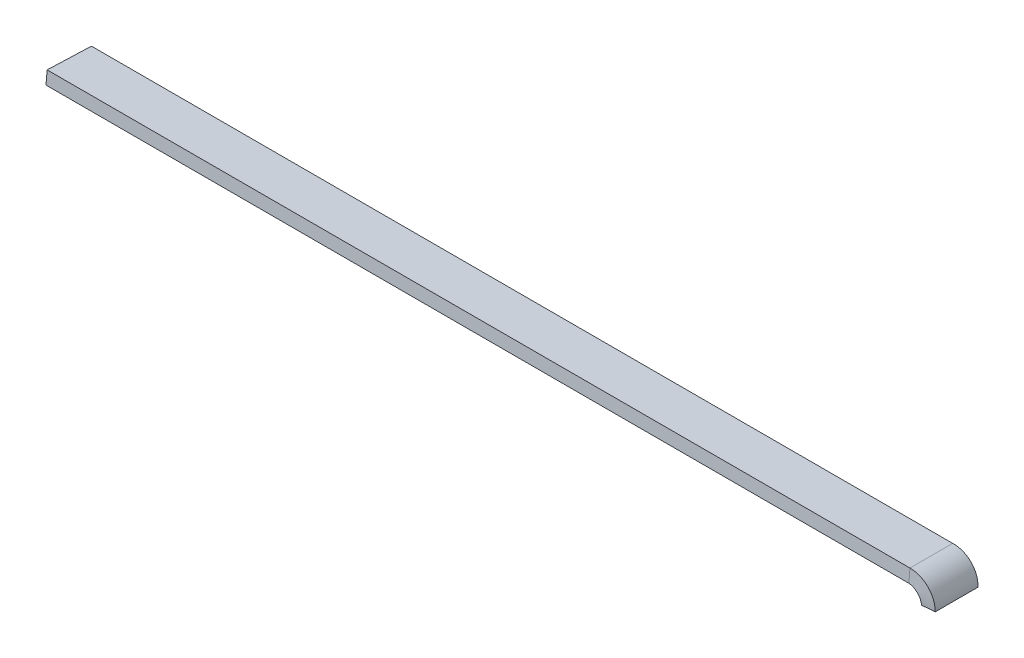
ISO-10303-21;
HEADER;
FILE_DESCRIPTION(('STEP AP214'),'2;1');
FILE_NAME('part.step','',(''),(''),'','','');
FILE_SCHEMA(('AUTOMOTIVE_DESIGN { 1 0 10303 214 1 1 1 1 }'));
ENDSEC;
DATA;
#1=APPLICATION_CONTEXT('core data for automotive mechanical design processes');
#2=APPLICATION_PROTOCOL_DEFINITION('international standard','automotive_design',2000,#1);
#3=PRODUCT_CONTEXT('',#1,'mechanical');
#4=PRODUCT('Part','Part','',(#3));
#5=PRODUCT_RELATED_PRODUCT_CATEGORY('part','',(#4));
#6=PRODUCT_DEFINITION_FORMATION('','',#4);
#7=PRODUCT_DEFINITION_CONTEXT('part definition',#1,'design');
#8=PRODUCT_DEFINITION('design','',#6,#7);
#9=PRODUCT_DEFINITION_SHAPE('','',#8);
#10=(LENGTH_UNIT() NAMED_UNIT(*) SI_UNIT(.MILLI.,.METRE.));
#11=(NAMED_UNIT(*) PLANE_ANGLE_UNIT() SI_UNIT($,.RADIAN.));
#12=(NAMED_UNIT(*) SI_UNIT($,.STERADIAN.) SOLID_ANGLE_UNIT());
#13=UNCERTAINTY_MEASURE_WITH_UNIT(LENGTH_MEASURE(1.E-05),#10,'distance_accuracy_value','');
#14=(GEOMETRIC_REPRESENTATION_CONTEXT(3) GLOBAL_UNCERTAINTY_ASSIGNED_CONTEXT((#13)) GLOBAL_UNIT_ASSIGNED_CONTEXT((#10,
#11,#12)) REPRESENTATION_CONTEXT('',''));
#15=CARTESIAN_POINT('',(0.,0.,0.));
#16=DIRECTION('',(0.,0.,1.));
#17=DIRECTION('',(1.,0.,0.));
#18=AXIS2_PLACEMENT_3D('',#15,#16,#17);
#19=CARTESIAN_POINT('',(0.9067001771097,5.017924103223,621.706));
#20=DIRECTION('',(-0.0868265938642471,-0.0868265938642471,-0.992432509138967));
#21=DIRECTION('',(-0.996194698091746,0.,0.0871557427476577));
#22=AXIS2_PLACEMENT_3D('',#19,#20,#21);
#23=CYLINDRICAL_SURFACE('',#22,1.);
#24=CARTESIAN_POINT('',(-42.3060066619831,-38.1947827366965,119.638604326719));
#25=CARTESIAN_POINT('',(-42.3413228470449,-38.1594269535071,119.638593813166));
#26=CARTESIAN_POINT('',(-42.3793150853468,-38.1267659827884,119.638855411307));
#27=CARTESIAN_POINT('',(-42.4597744274169,-38.0674292435776,119.639848616315));
#28=CARTESIAN_POINT('',(-42.5022461890844,-38.0407597971777,119.640580716528));
#29=CARTESIAN_POINT('',(-42.5961410293597,-37.9912123118771,119.642554607293));
#30=CARTESIAN_POINT('',(-42.648022858914,-37.9692020525853,119.643847948622));
#31=CARTESIAN_POINT('',(-42.7546831120349,-37.9342240884301,119.64690509844));
#32=CARTESIAN_POINT('',(-42.8094574519616,-37.9212439835882,119.648668257165));
#33=CARTESIAN_POINT('',(-42.8887916499294,-37.9093528668859,119.651546358698));
#34=CARTESIAN_POINT('',(-42.9128391117539,-37.9066383607995,119.652460536334));
#35=CARTESIAN_POINT('',(-42.9610274450484,-37.9029606798878,119.654376358654));
#36=CARTESIAN_POINT('',(-42.9851681197073,-37.9019948569667,119.655377868672));
#37=CARTESIAN_POINT('',(-43.0093212811459,-37.9019026509197,119.656422129021));
#38=B_SPLINE_CURVE_WITH_KNOTS('',3,(#24,#25,#26,#27,#28,#29,#30,#31,#32,#33,#34,#35,#36,#37),
.UNSPECIFIED.,.F.,.F.,(4,2,2,2,2,2,4),(0.,0.149753145675987,0.299663572257379,0.46798334398652,
0.636071524624927,0.708671414594532,0.78116127160662),.UNSPECIFIED.);
#39=CARTESIAN_POINT('',(-42.3060066619851,-38.1947827366984,119.638604326697));
#40=VERTEX_POINT('',#39);
#41=CARTESIAN_POINT('',(-43.0093212791851,-37.9019026509321,119.656422128847));
#42=VERTEX_POINT('',#41);
#43=EDGE_CURVE('E24',#40,#42,#38,.T.);
#44=ORIENTED_EDGE('',*,*,#43,.T.);
#45=DIRECTION('',(0.08682659340322,0.0868265938677577,0.992432509178995));
#46=VECTOR('',#45,1.);
#47=CARTESIAN_POINT('',(-43.0093212841001,-37.9019026607583,119.656422016491));
#48=LINE('',#47,#46);
#49=CARTESIAN_POINT('',(-42.8480291107502,-37.7406104866713,121.500000002396));
#50=VERTEX_POINT('',#49);
#51=EDGE_CURVE('E101',#42,#50,#48,.T.);
#52=ORIENTED_EDGE('',*,*,#51,.T.);
#53=CARTESIAN_POINT('',(-42.8480291107746,-37.7406104866848,121.500000002251));
#54=CARTESIAN_POINT('',(-42.7962110754583,-37.7405753106187,121.500011053066));
#55=CARTESIAN_POINT('',(-42.7444054838403,-37.7446278572814,121.499926275227));
#56=CARTESIAN_POINT('',(-42.6420403829662,-37.7606827291457,121.499655839995));
#57=CARTESIAN_POINT('',(-42.5914808762208,-37.7726850703646,121.499470182399));
#58=CARTESIAN_POINT('',(-42.4886919101101,-37.8057445695691,121.499072769477));
#59=CARTESIAN_POINT('',(-42.4366781049927,-37.8274767994237,121.498860131334));
#60=CARTESIAN_POINT('',(-42.3370631523629,-37.879394088344,121.498499793113));
#61=CARTESIAN_POINT('',(-42.2894616809946,-37.9095785263803,121.498352088266));
#62=CARTESIAN_POINT('',(-42.2001984244632,-37.9774133472322,121.498168438104));
#63=CARTESIAN_POINT('',(-42.158515540875,-38.0150360047178,121.498132085789));
#64=CARTESIAN_POINT('',(-42.0820546566997,-38.0967776449116,121.498181089337));
#65=CARTESIAN_POINT('',(-42.0472765518183,-38.1408965294789,121.49826644336));
#66=CARTESIAN_POINT('',(-42.0010718619447,-38.2109218030447,121.498461626571));
#67=CARTESIAN_POINT('',(-41.9866622032811,-38.2349088911212,121.498537897363));
#68=CARTESIAN_POINT('',(-41.9599233283921,-38.2839861342361,121.498706018941));
#69=CARTESIAN_POINT('',(-41.9475922384358,-38.3090752698278,121.498797855545));
#70=CARTESIAN_POINT('',(-41.9138382420349,-38.3857727892569,121.499087388104));
#71=CARTESIAN_POINT('',(-41.8956299806478,-38.4388486924575,121.499299229812));
#72=CARTESIAN_POINT('',(-41.8719763756272,-38.5328708459437,121.499627723138));
#73=CARTESIAN_POINT('',(-41.8644285955422,-38.5733096392885,121.499754729338));
#74=CARTESIAN_POINT('',(-41.8543570325861,-38.6547599963722,121.499939825366));
#75=CARTESIAN_POINT('',(-41.8518273543112,-38.6957708309246,121.499997996032));
#76=CARTESIAN_POINT('',(-41.8518344384368,-38.7368051667077,121.499999709199));
#77=B_SPLINE_CURVE_WITH_KNOTS('',3,(#53,#54,#55,#56,#57,#58,#59,#60,#61,#62,#63,#64,#65,#66,#67,
#68,#69,#70,#71,#72,#73,#74,#75,#76),.UNSPECIFIED.,.F.,.F.,(4,2,2,2,2,2,2,2,2,2,2,4),(0.,
0.155274136338601,0.31054858552287,0.478847467941307,0.647133987775294,0.814804674542826,
0.982472828505676,1.06633391722347,1.15011900011304,1.31755647247005,1.44068000924492,
1.56365881123626),.UNSPECIFIED.);
#78=CARTESIAN_POINT('',(-41.8518344384384,-38.7368051667078,121.4999997092));
#79=VERTEX_POINT('',#78);
#80=EDGE_CURVE('E121',#50,#79,#77,.T.);
#81=ORIENTED_EDGE('',*,*,#80,.T.);
#82=DIRECTION('',(0.0868265938625753,0.0868265938642524,0.992432509139113));
#83=VECTOR('',#82,1.);
#84=CARTESIAN_POINT('',(-42.01312668259,-38.898097410861,119.6564209225));
#85=LINE('',#84,#83);
#86=CARTESIAN_POINT('',(-42.0131266299219,-38.8980973581931,119.656421524499));
#87=VERTEX_POINT('',#86);
#88=EDGE_CURVE('E97',#87,#79,#85,.T.);
#89=ORIENTED_EDGE('',*,*,#88,.F.);
#90=CARTESIAN_POINT('',(-42.013126577157,-38.8980973319105,119.656422127603));
#91=CARTESIAN_POINT('',(-42.0132876373387,-38.8481792562705,119.654254624449));
#92=CARTESIAN_POINT('',(-42.0172390455984,-38.7982792455492,119.65228490139));
#93=CARTESIAN_POINT('',(-42.0325268082614,-38.6995482369846,119.648729684385));
#94=CARTESIAN_POINT('',(-42.0438718568742,-38.6507185677202,119.647144645808));
#95=CARTESIAN_POINT('',(-42.0756179083208,-38.5493169127379,119.64417795588));
#96=CARTESIAN_POINT('',(-42.0969739390252,-38.4970405094693,119.642846523088));
#97=CARTESIAN_POINT('',(-42.1481608993835,-38.3968693320253,119.640675388055));
#98=CARTESIAN_POINT('',(-42.177979612731,-38.348968372483,119.639834982301));
#99=CARTESIAN_POINT('',(-42.225977040728,-38.2846302528329,119.639069302541));
#100=CARTESIAN_POINT('',(-42.2410837040384,-38.2658411740296,119.63889548783));
#101=CARTESIAN_POINT('',(-42.2725900732733,-38.2294282906851,119.638663083063));
#102=CARTESIAN_POINT('',(-42.2889878285034,-38.2118027994575,119.63860432252));
#103=CARTESIAN_POINT('',(-42.306006661987,-38.1947827367003,119.638604326675));
#104=B_SPLINE_CURVE_WITH_KNOTS('',3,(#90,#91,#92,#93,#94,#95,#96,#97,#98,#99,#100,#101,#102,
#103),.UNSPECIFIED.,.F.,.F.,(4,2,2,2,2,2,4),(0.,0.149733606469797,0.299643603721288,
0.468299581467362,0.636713323524752,0.708990119965772,0.781159735963205),.UNSPECIFIED.);
#105=EDGE_CURVE('E95',#87,#40,#104,.T.);
#106=ORIENTED_EDGE('',*,*,#105,.T.);
#107=EDGE_LOOP('',(#44,#52,#81,#89,#106));
#108=FACE_BOUND('',#107,.T.);
#109=ADVANCED_FACE('F17',(#108),#23,.T.);
#110=CARTESIAN_POINT('',(-42.39254581876,-38.75555674729,121.545304739));
#111=CARTESIAN_POINT('',(-42.19854379232,-38.76340444666,121.5290183457));
#112=CARTESIAN_POINT('',(-42.00454176588,-38.77125214603,121.5127319524));
#113=CARTESIAN_POINT('',(-41.81053973944,-38.7790998454,121.4964455592));
#114=CARTESIAN_POINT('',(-42.39223019528,-38.74930632017,121.5459747104));
#115=CARTESIAN_POINT('',(-42.19813947052,-38.75453927643,121.5294517966));
#116=CARTESIAN_POINT('',(-42.00404874575,-38.75977223268,121.5129288829));
#117=CARTESIAN_POINT('',(-41.80995802099,-38.76500518894,121.4964059691));
#118=CARTESIAN_POINT('',(-42.38965937998,-38.66232931699,121.5550272977));
#119=CARTESIAN_POINT('',(-42.19509378997,-38.63116139852,121.5352781747));
#120=CARTESIAN_POINT('',(-42.00052819996,-38.59999348006,121.5155290517));
#121=CARTESIAN_POINT('',(-41.80596260996,-38.5688255616,121.4957799288));
#122=CARTESIAN_POINT('',(-42.43303465109,-38.4958007504,121.5654113252));
#123=CARTESIAN_POINT('',(-42.25770700477,-38.39452889858,121.5412120048));
#124=CARTESIAN_POINT('',(-42.08237935846,-38.29325704675,121.5170126844));
#125=CARTESIAN_POINT('',(-41.90705171214,-38.19198519492,121.4928133639));
#126=CARTESIAN_POINT('',(-42.60840763403,-38.32115815075,121.5653232954));
#127=CARTESIAN_POINT('',(-42.50771884144,-38.14554717545,121.541150198));
#128=CARTESIAN_POINT('',(-42.40703004886,-37.96993620014,121.5169771006));
#129=CARTESIAN_POINT('',(-42.30634125627,-37.79432522483,121.4928040031));
#130=CARTESIAN_POINT('',(-42.77429486765,-38.27842250574,121.5550085009));
#131=CARTESIAN_POINT('',(-42.74343958104,-38.08384837702,121.5352859826));
#132=CARTESIAN_POINT('',(-42.71258429442,-37.88927424831,121.5155634644));
#133=CARTESIAN_POINT('',(-42.6817290078,-37.69470011959,121.4958409461));
#134=CARTESIAN_POINT('',(-42.86073951127,-38.28101321544,121.5459446643));
#135=CARTESIAN_POINT('',(-42.8660597417,-38.08692365148,121.5294294876));
#136=CARTESIAN_POINT('',(-42.87137997212,-37.89283408751,121.5129143109));
#137=CARTESIAN_POINT('',(-42.87670020254,-37.69874452355,121.4963991342));
#138=CARTESIAN_POINT('',(-42.86709224571,-38.2813388599,121.5452578034));
#139=CARTESIAN_POINT('',(-42.87506978468,-38.08734127963,121.5289831586));
#140=CARTESIAN_POINT('',(-42.88304732365,-37.89334369935,121.5127085138));
#141=CARTESIAN_POINT('',(-42.89102486261,-37.69934611908,121.496433869));
#142=B_SPLINE_SURFACE_WITH_KNOTS('',3,3,((#110,#111,#112,#113),(#114,#115,#116,#117),(#118,#119,
#120,#121),(#122,#123,#124,#125),(#126,#127,#128,#129),(#130,#131,#132,#133),(#134,#135,#136,
#137),(#138,#139,#140,#141)),.UNSPECIFIED.,.F.,.F.,.F.,(4,1,1,1,1,4),(4,4),(0.1684421981177,
0.1846252915357,0.3935743312168,0.6025233708979,0.8114724105789,0.8280553375301),
(0.1605411497248,0.6438558517289),.UNSPECIFIED.);
#143=DIRECTION('',(3.00566262356155E-10,0.996194698089436,-0.0871557427740569));
#144=VECTOR('',#143,1.);
#145=CARTESIAN_POINT('',(-42.8480291107116,-37.9896086962448,121.521784522826));
#146=LINE('',#145,#144);
#147=CARTESIAN_POINT('',(-42.8480291108202,-38.2387078356967,121.543577874013));
#148=VERTEX_POINT('',#147);
#149=EDGE_CURVE('E93',#148,#50,#146,.T.);
#150=CARTESIAN_POINT('',(-42.8480291107804,-38.2387078357306,121.543577873626));
#151=CARTESIAN_POINT('',(-42.8202820146055,-38.2384719122108,121.5459645693));
#152=CARTESIAN_POINT('',(-42.7924900821376,-38.2405820338764,121.54804940323));
#153=CARTESIAN_POINT('',(-42.7376127944707,-38.2493827823975,121.551663455814));
#154=CARTESIAN_POINT('',(-42.7105272303899,-38.2560720388296,121.553192840492));
#155=CARTESIAN_POINT('',(-42.6578168839355,-38.2739277629518,121.555746659589));
#156=CARTESIAN_POINT('',(-42.6321934836884,-38.2850983891745,121.556770623024));
#157=CARTESIAN_POINT('',(-42.583200298231,-38.3116125839033,121.558341905429));
#158=CARTESIAN_POINT('',(-42.5598297015988,-38.3269546422653,121.558889396591));
#159=CARTESIAN_POINT('',(-42.5162501745831,-38.3612055813726,121.559524957987));
#160=CARTESIAN_POINT('',(-42.4960112084315,-38.3800761686377,121.559617693813));
#161=CARTESIAN_POINT('',(-42.4589909623034,-38.4209463823606,121.559359165914));
#162=CARTESIAN_POINT('',(-42.442209589063,-38.442945924392,121.559007914167));
#163=CARTESIAN_POINT('',(-42.4126378232436,-38.4893382849582,121.557844772078));
#164=CARTESIAN_POINT('',(-42.3998312109413,-38.513720828501,121.557034792956));
#165=CARTESIAN_POINT('',(-42.378452866195,-38.5642558963362,121.554936160357));
#166=CARTESIAN_POINT('',(-42.3698800312028,-38.5904079577967,121.553647631654));
#167=CARTESIAN_POINT('',(-42.358844811927,-38.6366813223091,121.550969675027));
#168=CARTESIAN_POINT('',(-42.3553672069256,-38.6565742358178,121.549696470277));
#169=CARTESIAN_POINT('',(-42.350834572614,-38.6965856004491,121.546859323927));
#170=CARTESIAN_POINT('',(-42.3497761610228,-38.7167036971214,121.545295791549));
#171=CARTESIAN_POINT('',(-42.3499317873181,-38.7368051883874,121.543577582454));
#172=B_SPLINE_CURVE_WITH_KNOTS('',3,(#150,#151,#152,#153,#154,#155,#156,#157,#158,#159,#160,
#161,#162,#163,#164,#165,#166,#167,#168,#169,#170,#171),.UNSPECIFIED.,.F.,.F.,(4,2,2,2,2,2,2,2,
2,2,4),(0.,0.0834552426064926,0.166885520006722,0.250393397123289,0.333871082834483,
0.416490505653344,0.499107699629159,0.581383186791966,0.663637236693581,0.7241993402554,
0.784676719846154),.UNSPECIFIED.);
#173=CARTESIAN_POINT('',(-42.3499317873161,-38.73680518839,121.543577582477));
#174=VERTEX_POINT('',#173);
#175=EDGE_CURVE('E107',#148,#174,#172,.T.);
#176=DIRECTION('',(-0.996194697754786,-4.33746649706125E-08,0.0871557465991061));
#177=VECTOR('',#176,1.);
#178=CARTESIAN_POINT('',(-41.8518344384399,-38.7368051667079,121.499999709201));
#179=LINE('',#178,#177);
#180=EDGE_CURVE('E117',#79,#174,#179,.T.);
#181=ORIENTED_EDGE('',*,*,#80,.F.);
#182=ORIENTED_EDGE('',*,*,#149,.F.);
#183=ORIENTED_EDGE('',*,*,#175,.T.);
#184=ORIENTED_EDGE('',*,*,#180,.F.);
#185=EDGE_LOOP('',(#181,#182,#183,#184));
#186=FACE_BOUND('',#185,.T.);
#187=ADVANCED_FACE('F156',(#186),#142,.F.);
#188=CARTESIAN_POINT('',(-42.18152918229,-38.81745124696,120.5999998545));
#189=DIRECTION('',(0.0075674796593141,-0.996223440096613,0.0864961886656012));
#190=DIRECTION('',(0.,-0.0864986654497164,-0.996251966560377));
#191=AXIS2_PLACEMENT_3D('',#188,#189,#190);
#192=PLANE('',#191);
#193=ORIENTED_EDGE('',*,*,#180,.T.);
#194=DIRECTION('',(-0.0868265938642471,-0.0868265938642471,-0.992432509138967));
#195=VECTOR('',#194,1.);
#196=CARTESIAN_POINT('',(1.4047975259908,5.01792412491495,621.662422126743));
#197=LINE('',#196,#195);
#198=CARTESIAN_POINT('',(-42.5112239261326,-38.8980973272077,119.69999999978));
#199=VERTEX_POINT('',#198);
#200=EDGE_CURVE('E109',#174,#199,#197,.T.);
#201=ORIENTED_EDGE('',*,*,#200,.T.);
#202=DIRECTION('',(0.996194697761046,4.33596188534626E-08,-0.0871557465275618));
#203=VECTOR('',#202,1.);
#204=CARTESIAN_POINT('',(-42.262101932774,-38.8980973163623,119.678204648554));
#205=LINE('',#204,#203);
#206=EDGE_CURVE('E102',#199,#87,#205,.T.);
#207=ORIENTED_EDGE('',*,*,#206,.T.);
#208=ORIENTED_EDGE('',*,*,#88,.T.);
#209=EDGE_LOOP('',(#193,#201,#207,#208));
#210=FACE_BOUND('',#209,.T.);
#211=ADVANCED_FACE('F161',(#210),#192,.T.);
#212=CARTESIAN_POINT('',(-42.69992982919,-38.562430902,119.7051870022));
#213=CARTESIAN_POINT('',(-42.56889432235,-38.4202110252,119.6812802539));
#214=CARTESIAN_POINT('',(-42.4378588155,-38.2779911484,119.6573735056));
#215=CARTESIAN_POINT('',(-42.30682330866,-38.1357712716,119.6334667573));
#216=CARTESIAN_POINT('',(-42.69535719349,-38.566627625,119.7051849249));
#217=CARTESIAN_POINT('',(-42.56237640203,-38.42619527987,119.681264375));
#218=CARTESIAN_POINT('',(-42.42939561057,-38.28576293474,119.6573438251));
#219=CARTESIAN_POINT('',(-42.29641481911,-38.14533058961,119.6334232752));
#220=CARTESIAN_POINT('',(-42.6611703085,-38.59940202564,119.7051788275));
#221=CARTESIAN_POINT('',(-42.51364163757,-38.4729249318,119.6812064294));
#222=CARTESIAN_POINT('',(-42.36611296664,-38.34644783795,119.6572340312));
#223=CARTESIAN_POINT('',(-42.21858429571,-38.21997074411,119.6332616331));
#224=CARTESIAN_POINT('',(-42.60832169338,-38.66978796622,119.7052545322));
#225=CARTESIAN_POINT('',(-42.43824367213,-38.57321826064,119.681925879));
#226=CARTESIAN_POINT('',(-42.26816565088,-38.47664855505,119.6585972257));
#227=CARTESIAN_POINT('',(-42.09808762963,-38.38007884946,119.6352685724));
#228=CARTESIAN_POINT('',(-42.56461124227,-38.77585573685,119.7047243286));
#229=CARTESIAN_POINT('',(-42.37570762155,-38.72421590182,119.6836795032));
#230=CARTESIAN_POINT('',(-42.18680400084,-38.6725760668,119.6626346777));
#231=CARTESIAN_POINT('',(-41.99790038012,-38.62093623177,119.6415898522));
#232=CARTESIAN_POINT('',(-42.55238976624,-38.86315115764,119.7039515295));
#233=CARTESIAN_POINT('',(-42.3580146202,-38.84840073908,119.6856554133));
#234=CARTESIAN_POINT('',(-42.16363947416,-38.83365032052,119.6673592971));
#235=CARTESIAN_POINT('',(-41.96926432812,-38.81889990196,119.649063181));
#236=CARTESIAN_POINT('',(-42.55342305001,-38.9106207391,119.7035810286));
#237=CARTESIAN_POINT('',(-42.35931850046,-38.91590726191,119.6870615918));
#238=CARTESIAN_POINT('',(-42.16521395091,-38.92119378471,119.670542155));
#239=CARTESIAN_POINT('',(-41.97110940136,-38.92648030751,119.6540227181));
#240=CARTESIAN_POINT('',(-42.55369602663,-38.91689449208,119.7035332949));
#241=CARTESIAN_POINT('',(-42.35968491437,-38.92482877759,119.687253682));
#242=CARTESIAN_POINT('',(-42.16567380212,-38.93276306309,119.6709740691));
#243=CARTESIAN_POINT('',(-41.97166268987,-38.9406973486,119.6546944562));
#244=B_SPLINE_SURFACE_WITH_KNOTS('',3,3,((#212,#213,#214,#215),(#216,#217,#218,#219),(#220,#221,
#222,#223),(#224,#225,#226,#227),(#228,#229,#230,#231),(#232,#233,#234,#235),(#236,#237,#238,
#239),(#240,#241,#242,#243)),.UNSPECIFIED.,.F.,.F.,.F.,(4,1,1,1,1,4),(4,4),(0.1508027032366,
0.1824388225824,0.3925832769371,0.6027277312919,0.8128721856467,0.8448422145293),
(0.1605780104149,0.6440416285883),.UNSPECIFIED.);
#245=CARTESIAN_POINT('',(-42.5112239261337,-38.8980973272088,119.699999999768));
#246=CARTESIAN_POINT('',(-42.5112184201483,-38.8770538931287,119.699996861849));
#247=CARTESIAN_POINT('',(-42.5125463171051,-38.8560170356519,119.70001292732));
#248=CARTESIAN_POINT('',(-42.5178332503837,-38.8142431610356,119.700060912373));
#249=CARTESIAN_POINT('',(-42.5217963967152,-38.793506664048,119.7000928567));
#250=CARTESIAN_POINT('',(-42.5340383349443,-38.7460136483039,119.700159244966));
#251=CARTESIAN_POINT('',(-42.5433046090946,-38.7195060965854,119.700191090063));
#252=CARTESIAN_POINT('',(-42.5661625900745,-38.6684400338824,119.700178635029));
#253=CARTESIAN_POINT('',(-42.5797516126467,-38.6438803251561,119.700134382077));
#254=CARTESIAN_POINT('',(-42.6043117701908,-38.6071763255248,119.700067616168));
#255=CARTESIAN_POINT('',(-42.6139876136758,-38.5941477454245,119.700043774601));
#256=CARTESIAN_POINT('',(-42.6345496077774,-38.5691153289554,119.700009184969));
#257=CARTESIAN_POINT('',(-42.6454339729819,-38.557110026034,119.699998417862));
#258=CARTESIAN_POINT('',(-42.6568845409429,-38.5456606148321,119.699999999952));
#259=B_SPLINE_CURVE_WITH_KNOTS('',3,(#245,#246,#247,#248,#249,#250,#251,#252,#253,#254,#255,
#256,#257,#258),.UNSPECIFIED.,.F.,.F.,(4,2,2,2,2,2,4),(0.,0.0630755956077146,0.126249797172645,
0.210083480994524,0.293865208669244,0.342480518163267,0.391024938067236),.UNSPECIFIED.);
#260=CARTESIAN_POINT('',(-42.6568845409412,-38.545660614829,119.699999999979));
#261=VERTEX_POINT('',#260);
#262=EDGE_CURVE('E106',#199,#261,#259,.T.);
#263=DIRECTION('',(0.701755757092264,0.70175575707364,-0.122791346608247));
#264=VECTOR('',#263,1.);
#265=CARTESIAN_POINT('',(-42.4813927613947,-38.3701688352856,119.669292917505));
#266=LINE('',#265,#264);
#267=EDGE_CURVE('E85',#261,#40,#266,.T.);
#268=ORIENTED_EDGE('',*,*,#105,.F.);
#269=ORIENTED_EDGE('',*,*,#206,.F.);
#270=ORIENTED_EDGE('',*,*,#262,.T.);
#271=ORIENTED_EDGE('',*,*,#267,.T.);
#272=EDGE_LOOP('',(#268,#269,#270,#271));
#273=FACE_BOUND('',#272,.T.);
#274=ADVANCED_FACE('F104',(#273),#244,.F.);
#275=CARTESIAN_POINT('',(204.,-37.90190265095,119.6564221286));
#276=DIRECTION('',(0.,-0.996194698091745,0.0871557427476639));
#277=DIRECTION('',(0.,-0.0871557427476639,-0.996194698091745));
#278=AXIS2_PLACEMENT_3D('',#275,#276,#277);
#279=PLANE('',#278);
#280=DIRECTION('',(1.,0.,0.));
#281=VECTOR('',#280,1.);
#282=CARTESIAN_POINT('',(-59.83629417045,-37.7406104866571,121.500000002547));
#283=LINE('',#282,#281);
#284=CARTESIAN_POINT('',(-76.8245591720683,-37.7406104867011,121.500000002064));
#285=VERTEX_POINT('',#284);
#286=EDGE_CURVE('E130',#50,#285,#283,.F.);
#287=ORIENTED_EDGE('',*,*,#286,.F.);
#288=ORIENTED_EDGE('',*,*,#51,.F.);
#289=DIRECTION('',(1.,0.,0.));
#290=VECTOR('',#289,1.);
#291=CARTESIAN_POINT('',(-59.96524912662,-37.9019026509334,119.656422128847));
#292=LINE('',#291,#290);
#293=CARTESIAN_POINT('',(-76.9211770015794,-37.9019026509289,119.656422128898));
#294=VERTEX_POINT('',#293);
#295=EDGE_CURVE('E187',#294,#42,#292,.T.);
#296=ORIENTED_EDGE('',*,*,#295,.F.);
#297=DIRECTION('',(0.0521373445210766,0.087037204290652,0.994839797342043));
#298=VECTOR('',#297,1.);
#299=CARTESIAN_POINT('',(-76.9211769943182,-37.90190265092,119.656422129));
#300=LINE('',#299,#298);
#301=EDGE_CURVE('E202',#294,#285,#300,.T.);
#302=ORIENTED_EDGE('',*,*,#301,.T.);
#303=EDGE_LOOP('',(#287,#288,#296,#302));
#304=FACE_BOUND('',#303,.T.);
#305=ADVANCED_FACE('F143',(#304),#279,.F.);
#306=CARTESIAN_POINT('',(-43.02800865913,-38.44246733394,119.7035341298));
#307=CARTESIAN_POINT('',(-43.03589666792,-38.24845346361,119.687250227));
#308=CARTESIAN_POINT('',(-43.04378467671,-38.05443959329,119.6709663242));
#309=CARTESIAN_POINT('',(-43.0516726855,-37.86042572297,119.6546824214));
#310=CARTESIAN_POINT('',(-43.02177152303,-38.44219753448,119.7035815996));
#311=CARTESIAN_POINT('',(-43.02702720299,-38.24809144135,119.6870593294));
#312=CARTESIAN_POINT('',(-43.03228288295,-38.05398534823,119.6705370592));
#313=CARTESIAN_POINT('',(-43.03753856292,-37.8598792551,119.654014789));
#314=CARTESIAN_POINT('',(-42.97433327703,-38.44117077051,119.7039518947));
#315=CARTESIAN_POINT('',(-42.9595651087,-38.24679672557,119.685654322));
#316=CARTESIAN_POINT('',(-42.94479694037,-38.05242268063,119.6673567493));
#317=CARTESIAN_POINT('',(-42.93002877204,-37.85804863569,119.6490591766));
#318=CARTESIAN_POINT('',(-42.88706696876,-38.45339027198,119.7047244382));
#319=CARTESIAN_POINT('',(-42.83542146544,-38.26448684718,119.683679134));
#320=CARTESIAN_POINT('',(-42.78377596213,-38.07558342239,119.6626338298));
#321=CARTESIAN_POINT('',(-42.73213045881,-37.88667999759,119.6415885256));
#322=CARTESIAN_POINT('',(-42.78100080973,-38.49710461424,119.7052545347));
#323=CARTESIAN_POINT('',(-42.68442583923,-38.32702853305,119.6819255906));
#324=CARTESIAN_POINT('',(-42.58785086872,-38.15695245185,119.6585966465));
#325=CARTESIAN_POINT('',(-42.49127589822,-37.98687637065,119.6352677024));
#326=CARTESIAN_POINT('',(-42.71058957614,-38.54997484901,119.7051787919));
#327=CARTESIAN_POINT('',(-42.58409628758,-38.40245746233,119.6812059641));
#328=CARTESIAN_POINT('',(-42.45760299902,-38.25494007565,119.6572331363));
#329=CARTESIAN_POINT('',(-42.33110971046,-38.10742268897,119.6332603086));
#330=CARTESIAN_POINT('',(-42.67779524388,-38.58419201222,119.7051849357));
#331=CARTESIAN_POINT('',(-42.53733810719,-38.45123544652,119.6812643363));
#332=CARTESIAN_POINT('',(-42.3968809705,-38.31827888081,119.6573437369));
#333=CARTESIAN_POINT('',(-42.25642383381,-38.18532231511,119.6334231375));
#334=CARTESIAN_POINT('',(-42.67357222379,-38.58879593943,119.7051870442));
#335=CARTESIAN_POINT('',(-42.53131633632,-38.45779797456,119.6812804299));
#336=CARTESIAN_POINT('',(-42.38906044885,-38.3268000097,119.6573738156));
#337=CARTESIAN_POINT('',(-42.24680456139,-38.19580204483,119.6334672012));
#338=B_SPLINE_SURFACE_WITH_KNOTS('',3,3,((#306,#307,#308,#309),(#310,#311,#312,#313),(#314,#315,
#316,#317),(#318,#319,#320,#321),(#322,#323,#324,#325),(#326,#327,#328,#329),(#330,#331,#332,
#333),(#334,#335,#336,#337)),.UNSPECIFIED.,.F.,.F.,.F.,(4,1,1,1,1,4),(4,4),(0.151137073828,
0.1829103720766,0.3930165693121,0.6031227665477,0.8132289637832,0.8450713652632),
(0.1605780150263,0.6440444560481),.UNSPECIFIED.);
#339=CARTESIAN_POINT('',(-42.6568845409384,-38.5456606148276,119.700000000004));
#340=CARTESIAN_POINT('',(-42.6717662969407,-38.5307708512731,119.699994491996));
#341=CARTESIAN_POINT('',(-42.6875966744339,-38.5168403810674,119.700014727168));
#342=CARTESIAN_POINT('',(-42.7209120815116,-38.4910768721505,119.700071804094));
#343=CARTESIAN_POINT('',(-42.7383991066779,-38.4792464136573,119.700108666084));
#344=CARTESIAN_POINT('',(-42.7806765182158,-38.4544170436181,119.700172978858));
#345=CARTESIAN_POINT('',(-42.8059884249458,-38.4422959855345,119.700193436506));
#346=CARTESIAN_POINT('',(-42.8582812999501,-38.4224821891947,119.700166556557));
#347=CARTESIAN_POINT('',(-42.8852615638152,-38.4147875959573,119.700119247387));
#348=CARTESIAN_POINT('',(-42.9285960844596,-38.4062695193172,119.700057086299));
#349=CARTESIAN_POINT('',(-42.9446648838143,-38.4039178735923,119.700036941082));
#350=CARTESIAN_POINT('',(-42.9769274059992,-38.4007840028709,119.700008259297));
#351=CARTESIAN_POINT('',(-42.9931208714519,-38.3999991291105,119.699999703146));
#352=CARTESIAN_POINT('',(-43.00932127785,-38.3999999999986,119.700000000017));
#353=B_SPLINE_CURVE_WITH_KNOTS('',3,(#339,#340,#341,#342,#343,#344,#345,#346,#347,#348,#349,
#350,#351,#352),.UNSPECIFIED.,.F.,.F.,(4,2,2,2,2,2,4),(0.,0.0630978753499329,0.12627274838711,
0.210056864881494,0.293805844670325,0.342456509510986,0.391024856288205),.UNSPECIFIED.);
#354=CARTESIAN_POINT('',(-43.0093212796051,-38.3999999999419,119.700000000664));
#355=VERTEX_POINT('',#354);
#356=EDGE_CURVE('E123',#261,#355,#353,.T.);
#357=DIRECTION('',(0.,0.996194698138475,-0.0871557422135378));
#358=VECTOR('',#357,1.);
#359=CARTESIAN_POINT('',(-43.0093212841,-38.15095132546,119.6782110644));
#360=LINE('',#359,#358);
#361=EDGE_CURVE('E88',#42,#355,#360,.F.);
#362=ORIENTED_EDGE('',*,*,#43,.F.);
#363=ORIENTED_EDGE('',*,*,#267,.F.);
#364=ORIENTED_EDGE('',*,*,#356,.T.);
#365=ORIENTED_EDGE('',*,*,#361,.F.);
#366=EDGE_LOOP('',(#362,#363,#364,#365));
#367=FACE_BOUND('',#366,.T.);
#368=ADVANCED_FACE('F19',(#367),#338,.F.);
#369=CARTESIAN_POINT('',(0.9067001771097,5.017924103223,621.706));
#370=DIRECTION('',(-0.0868265938642471,-0.0868265938642471,-0.992432509138967));
#371=DIRECTION('',(-0.996194698091746,0.,0.0871557427476577));
#372=AXIS2_PLACEMENT_3D('',#369,#370,#371);
#373=CYLINDRICAL_SURFACE('',#372,0.5);
#374=ORIENTED_EDGE('',*,*,#262,.F.);
#375=ORIENTED_EDGE('',*,*,#200,.F.);
#376=ORIENTED_EDGE('',*,*,#175,.F.);
#377=DIRECTION('',(0.0868265938597616,0.0868265938642888,0.992432509139356));
#378=VECTOR('',#377,1.);
#379=CARTESIAN_POINT('',(-43.0093212751801,-38.3999999999912,119.7000000001));
#380=LINE('',#379,#378);
#381=EDGE_CURVE('E186',#355,#148,#380,.T.);
#382=ORIENTED_EDGE('',*,*,#381,.F.);
#383=ORIENTED_EDGE('',*,*,#356,.F.);
#384=EDGE_LOOP('',(#374,#375,#376,#382,#383));
#385=FACE_BOUND('',#384,.T.);
#386=ADVANCED_FACE('F135',(#385),#373,.F.);
#387=CARTESIAN_POINT('',(-59.83629417045,-37.98965916113,121.5217889388));
#388=DIRECTION('',(0.,0.087155745011588,0.996194697893677));
#389=DIRECTION('',(0.,-0.996194697893677,0.087155745011588));
#390=AXIS2_PLACEMENT_3D('',#387,#388,#389);
#391=PLANE('',#390);
#392=DIRECTION('',(-6.54581944213443E-08,-0.996194697828605,0.0871557457553497));
#393=VECTOR('',#392,1.);
#394=CARTESIAN_POINT('',(-76.8245591720683,-37.740610486723,121.500000001822));
#395=LINE('',#394,#393);
#396=CARTESIAN_POINT('',(-76.8245591920708,-38.2387078356228,121.543577874801));
#397=VERTEX_POINT('',#396);
#398=EDGE_CURVE('E199',#285,#397,#395,.T.);
#399=ORIENTED_EDGE('',*,*,#398,.T.);
#400=DIRECTION('',(1.,0.,0.));
#401=VECTOR('',#400,1.);
#402=CARTESIAN_POINT('',(204.,-38.2387078356628,121.543577874399));
#403=LINE('',#402,#401);
#404=EDGE_CURVE('E189',#148,#397,#403,.F.);
#405=ORIENTED_EDGE('',*,*,#404,.F.);
#406=ORIENTED_EDGE('',*,*,#149,.T.);
#407=ORIENTED_EDGE('',*,*,#286,.T.);
#408=EDGE_LOOP('',(#399,#405,#406,#407));
#409=FACE_BOUND('',#408,.T.);
#410=ADVANCED_FACE('F140',(#409),#391,.T.);
#411=CARTESIAN_POINT('',(-76.87286809955,-38.07030524327,120.600000002));
#412=DIRECTION('',(0.99863992374944,-0.00454413426386618,-0.0519389404734621));
#413=DIRECTION('',(-0.0519394767294145,0.,-0.99865023444501));
#414=AXIS2_PLACEMENT_3D('',#411,#412,#413);
#415=PLANE('',#414);
#416=ORIENTED_EDGE('',*,*,#301,.F.);
#417=DIRECTION('',(0.,0.996194698138475,-0.0871557422135378));
#418=VECTOR('',#417,1.);
#419=CARTESIAN_POINT('',(-76.92117700521,-38.15095132546,119.6782110644));
#420=LINE('',#419,#418);
#421=CARTESIAN_POINT('',(-76.9211770106674,-38.3999999999622,119.700000000427));
#422=VERTEX_POINT('',#421);
#423=EDGE_CURVE('E44',#422,#294,#420,.T.);
#424=ORIENTED_EDGE('',*,*,#423,.F.);
#425=DIRECTION('',(-0.0521373327347602,-0.0870372043454854,-0.994839797954941));
#426=VECTOR('',#425,1.);
#427=CARTESIAN_POINT('',(-76.8245592048101,-38.2387078356365,121.543577874701));
#428=LINE('',#427,#426);
#429=EDGE_CURVE('E35',#397,#422,#428,.T.);
#430=ORIENTED_EDGE('',*,*,#429,.F.);
#431=ORIENTED_EDGE('',*,*,#398,.F.);
#432=EDGE_LOOP('',(#416,#424,#430,#431));
#433=FACE_BOUND('',#432,.T.);
#434=ADVANCED_FACE('F217',(#433),#415,.F.);
#435=CARTESIAN_POINT('',(-59.96524912662,-38.15095132546,119.6782110644));
#436=DIRECTION('',(0.,-0.0871557422135378,-0.996194698138475));
#437=DIRECTION('',(0.,0.996194698138475,-0.0871557422135378));
#438=AXIS2_PLACEMENT_3D('',#435,#436,#437);
#439=PLANE('',#438);
#440=ORIENTED_EDGE('',*,*,#361,.T.);
#441=DIRECTION('',(1.,0.,0.));
#442=VECTOR('',#441,1.);
#443=CARTESIAN_POINT('',(204.,-38.3999999999212,119.7000000009));
#444=LINE('',#443,#442);
#445=EDGE_CURVE('E11',#422,#355,#444,.T.);
#446=ORIENTED_EDGE('',*,*,#445,.F.);
#447=ORIENTED_EDGE('',*,*,#423,.T.);
#448=ORIENTED_EDGE('',*,*,#295,.T.);
#449=EDGE_LOOP('',(#440,#446,#447,#448));
#450=FACE_BOUND('',#449,.T.);
#451=ADVANCED_FACE('F221',(#450),#439,.T.);
#452=CARTESIAN_POINT('',(204.,-38.4,119.7));
#453=DIRECTION('',(0.,-0.996194698091745,0.0871557427476639));
#454=DIRECTION('',(0.,-0.0871557427476639,-0.996194698091745));
#455=AXIS2_PLACEMENT_3D('',#452,#453,#454);
#456=PLANE('',#455);
#457=ORIENTED_EDGE('',*,*,#429,.T.);
#458=ORIENTED_EDGE('',*,*,#445,.T.);
#459=ORIENTED_EDGE('',*,*,#381,.T.);
#460=ORIENTED_EDGE('',*,*,#404,.T.);
#461=EDGE_LOOP('',(#457,#458,#459,#460));
#462=FACE_BOUND('',#461,.T.);
#463=ADVANCED_FACE('F219',(#462),#456,.T.);
#464=CLOSED_SHELL('',(#109,#187,#211,#274,#305,#368,#386,#410,#434,#451,#463));
#465=MANIFOLD_SOLID_BREP('B1',#464);
#466=ADVANCED_BREP_SHAPE_REPRESENTATION('',(#18,#465),#14);
#467=SHAPE_DEFINITION_REPRESENTATION(#9,#466);
ENDSEC;
END-ISO-10303-21;
